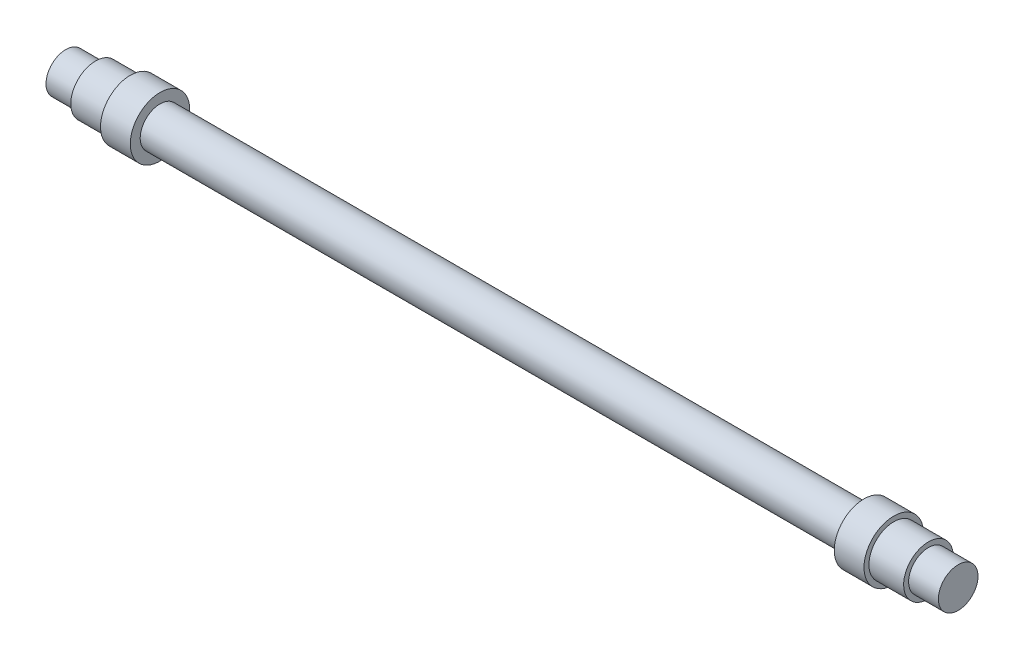
ISO-10303-21;
HEADER;
FILE_DESCRIPTION(('STEP AP214'),'2;1');
FILE_NAME('part.step','',(''),(''),'','','');
FILE_SCHEMA(('AUTOMOTIVE_DESIGN { 1 0 10303 214 1 1 1 1 }'));
ENDSEC;
DATA;
#1=APPLICATION_CONTEXT('core data for automotive mechanical design processes');
#2=APPLICATION_PROTOCOL_DEFINITION('international standard','automotive_design',2000,#1);
#3=PRODUCT_CONTEXT('',#1,'mechanical');
#4=PRODUCT('Part','Part','',(#3));
#5=PRODUCT_RELATED_PRODUCT_CATEGORY('part','',(#4));
#6=PRODUCT_DEFINITION_FORMATION('','',#4);
#7=PRODUCT_DEFINITION_CONTEXT('part definition',#1,'design');
#8=PRODUCT_DEFINITION('design','',#6,#7);
#9=PRODUCT_DEFINITION_SHAPE('','',#8);
#10=(LENGTH_UNIT() NAMED_UNIT(*) SI_UNIT(.MILLI.,.METRE.));
#11=(NAMED_UNIT(*) PLANE_ANGLE_UNIT() SI_UNIT($,.RADIAN.));
#12=(NAMED_UNIT(*) SI_UNIT($,.STERADIAN.) SOLID_ANGLE_UNIT());
#13=UNCERTAINTY_MEASURE_WITH_UNIT(LENGTH_MEASURE(1.E-05),#10,'distance_accuracy_value','');
#14=(GEOMETRIC_REPRESENTATION_CONTEXT(3) GLOBAL_UNCERTAINTY_ASSIGNED_CONTEXT((#13)) GLOBAL_UNIT_ASSIGNED_CONTEXT((#10,
#11,#12)) REPRESENTATION_CONTEXT('',''));
#15=CARTESIAN_POINT('',(0.,0.,0.));
#16=DIRECTION('',(0.,0.,1.));
#17=DIRECTION('',(1.,0.,0.));
#18=AXIS2_PLACEMENT_3D('',#15,#16,#17);
#19=CARTESIAN_POINT('',(0.,0.,0.));
#20=DIRECTION('',(-1.,0.,0.));
#21=DIRECTION('',(0.,-1.,0.));
#22=AXIS2_PLACEMENT_3D('',#19,#20,#21);
#23=PLANE('',#22);
#24=CARTESIAN_POINT('',(0.,0.,0.));
#25=DIRECTION('',(1.,0.,0.));
#26=DIRECTION('',(0.,1.,0.));
#27=AXIS2_PLACEMENT_3D('',#24,#25,#26);
#28=CIRCLE('',#27,1.99999999999999);
#29=CARTESIAN_POINT('',(0.,1.99999999999999,0.));
#30=VERTEX_POINT('',#29);
#31=EDGE_CURVE('E10',#30,#30,#28,.T.);
#32=ORIENTED_EDGE('',*,*,#31,.F.);
#33=EDGE_LOOP('',(#32));
#34=FACE_BOUND('',#33,.T.);
#35=ADVANCED_FACE('F31',(#34),#23,.T.);
#36=CARTESIAN_POINT('',(90.,0.,0.));
#37=DIRECTION('',(1.,0.,0.));
#38=DIRECTION('',(0.,1.,0.));
#39=AXIS2_PLACEMENT_3D('',#36,#37,#38);
#40=CYLINDRICAL_SURFACE('',#39,1.99999999999999);
#41=ORIENTED_EDGE('',*,*,#31,.T.);
#42=EDGE_LOOP('',(#41));
#43=FACE_BOUND('',#42,.T.);
#44=CARTESIAN_POINT('',(3.,0.,0.));
#45=DIRECTION('',(1.,0.,0.));
#46=DIRECTION('',(0.,1.,0.));
#47=AXIS2_PLACEMENT_3D('',#44,#45,#46);
#48=CIRCLE('',#47,1.99999999999999);
#49=CARTESIAN_POINT('',(3.,1.99999999999999,0.));
#50=VERTEX_POINT('',#49);
#51=EDGE_CURVE('E37',#50,#50,#48,.T.);
#52=ORIENTED_EDGE('',*,*,#51,.F.);
#53=EDGE_LOOP('',(#52));
#54=FACE_BOUND('',#53,.T.);
#55=ADVANCED_FACE('F97',(#43,#54),#40,.T.);
#56=CARTESIAN_POINT('',(3.,1.99999999999999,0.));
#57=DIRECTION('',(-1.,0.,0.));
#58=DIRECTION('',(0.,-1.,0.));
#59=AXIS2_PLACEMENT_3D('',#56,#57,#58);
#60=PLANE('',#59);
#61=ORIENTED_EDGE('',*,*,#51,.T.);
#62=EDGE_LOOP('',(#61));
#63=FACE_BOUND('',#62,.T.);
#64=CARTESIAN_POINT('',(3.,0.,0.));
#65=DIRECTION('',(1.,0.,0.));
#66=DIRECTION('',(0.,1.,0.));
#67=AXIS2_PLACEMENT_3D('',#64,#65,#66);
#68=CIRCLE('',#67,2.49999999999999);
#69=CARTESIAN_POINT('',(3.,2.49999999999999,0.));
#70=VERTEX_POINT('',#69);
#71=EDGE_CURVE('E41',#70,#70,#68,.T.);
#72=ORIENTED_EDGE('',*,*,#71,.F.);
#73=EDGE_LOOP('',(#72));
#74=FACE_BOUND('',#73,.T.);
#75=ADVANCED_FACE('F102',(#63,#74),#60,.T.);
#76=CARTESIAN_POINT('',(90.,0.,0.));
#77=DIRECTION('',(1.,0.,0.));
#78=DIRECTION('',(0.,1.,0.));
#79=AXIS2_PLACEMENT_3D('',#76,#77,#78);
#80=CYLINDRICAL_SURFACE('',#79,2.49999999999999);
#81=ORIENTED_EDGE('',*,*,#71,.T.);
#82=EDGE_LOOP('',(#81));
#83=FACE_BOUND('',#82,.T.);
#84=CARTESIAN_POINT('',(6.50000000000001,0.,0.));
#85=DIRECTION('',(1.,0.,0.));
#86=DIRECTION('',(0.,1.,0.));
#87=AXIS2_PLACEMENT_3D('',#84,#85,#86);
#88=CIRCLE('',#87,2.49999999999999);
#89=CARTESIAN_POINT('',(6.50000000000001,2.49999999999999,0.));
#90=VERTEX_POINT('',#89);
#91=EDGE_CURVE('E45',#90,#90,#88,.T.);
#92=ORIENTED_EDGE('',*,*,#91,.F.);
#93=EDGE_LOOP('',(#92));
#94=FACE_BOUND('',#93,.T.);
#95=ADVANCED_FACE('F106',(#83,#94),#80,.T.);
#96=CARTESIAN_POINT('',(6.5,2.49999999999999,0.));
#97=DIRECTION('',(-1.,0.,0.));
#98=DIRECTION('',(0.,-1.,0.));
#99=AXIS2_PLACEMENT_3D('',#96,#97,#98);
#100=PLANE('',#99);
#101=ORIENTED_EDGE('',*,*,#91,.T.);
#102=EDGE_LOOP('',(#101));
#103=FACE_BOUND('',#102,.T.);
#104=CARTESIAN_POINT('',(6.50000000000001,0.,0.));
#105=DIRECTION('',(1.,0.,0.));
#106=DIRECTION('',(0.,1.,0.));
#107=AXIS2_PLACEMENT_3D('',#104,#105,#106);
#108=CIRCLE('',#107,2.99999999999998);
#109=CARTESIAN_POINT('',(6.50000000000001,2.99999999999998,0.));
#110=VERTEX_POINT('',#109);
#111=EDGE_CURVE('E50',#110,#110,#108,.T.);
#112=ORIENTED_EDGE('',*,*,#111,.F.);
#113=EDGE_LOOP('',(#112));
#114=FACE_BOUND('',#113,.T.);
#115=ADVANCED_FACE('F112',(#103,#114),#100,.T.);
#116=CARTESIAN_POINT('',(90.,0.,0.));
#117=DIRECTION('',(1.,0.,0.));
#118=DIRECTION('',(0.,1.,0.));
#119=AXIS2_PLACEMENT_3D('',#116,#117,#118);
#120=CYLINDRICAL_SURFACE('',#119,2.99999999999998);
#121=ORIENTED_EDGE('',*,*,#111,.T.);
#122=EDGE_LOOP('',(#121));
#123=FACE_BOUND('',#122,.T.);
#124=CARTESIAN_POINT('',(9.50000000000001,0.,0.));
#125=DIRECTION('',(1.,0.,0.));
#126=DIRECTION('',(0.,1.,0.));
#127=AXIS2_PLACEMENT_3D('',#124,#125,#126);
#128=CIRCLE('',#127,2.99999999999998);
#129=CARTESIAN_POINT('',(9.50000000000001,2.99999999999998,0.));
#130=VERTEX_POINT('',#129);
#131=EDGE_CURVE('E53',#130,#130,#128,.T.);
#132=ORIENTED_EDGE('',*,*,#131,.F.);
#133=EDGE_LOOP('',(#132));
#134=FACE_BOUND('',#133,.T.);
#135=ADVANCED_FACE('F116',(#123,#134),#120,.T.);
#136=CARTESIAN_POINT('',(9.5,2.99999999999998,0.));
#137=DIRECTION('',(1.,0.,0.));
#138=DIRECTION('',(0.,1.,0.));
#139=AXIS2_PLACEMENT_3D('',#136,#137,#138);
#140=PLANE('',#139);
#141=ORIENTED_EDGE('',*,*,#131,.T.);
#142=EDGE_LOOP('',(#141));
#143=FACE_BOUND('',#142,.T.);
#144=CARTESIAN_POINT('',(9.50000000000001,0.,0.));
#145=DIRECTION('',(1.,0.,0.));
#146=DIRECTION('',(0.,1.,0.));
#147=AXIS2_PLACEMENT_3D('',#144,#145,#146);
#148=CIRCLE('',#147,1.99999999999999);
#149=CARTESIAN_POINT('',(9.50000000000001,1.99999999999999,0.));
#150=VERTEX_POINT('',#149);
#151=EDGE_CURVE('E56',#150,#150,#148,.T.);
#152=ORIENTED_EDGE('',*,*,#151,.F.);
#153=EDGE_LOOP('',(#152));
#154=FACE_BOUND('',#153,.T.);
#155=ADVANCED_FACE('F120',(#143,#154),#140,.T.);
#156=CARTESIAN_POINT('',(90.,0.,0.));
#157=DIRECTION('',(1.,0.,0.));
#158=DIRECTION('',(0.,1.,0.));
#159=AXIS2_PLACEMENT_3D('',#156,#157,#158);
#160=CYLINDRICAL_SURFACE('',#159,1.99999999999999);
#161=ORIENTED_EDGE('',*,*,#151,.T.);
#162=EDGE_LOOP('',(#161));
#163=FACE_BOUND('',#162,.T.);
#164=CARTESIAN_POINT('',(80.5,0.,0.));
#165=DIRECTION('',(1.,0.,0.));
#166=DIRECTION('',(0.,1.,0.));
#167=AXIS2_PLACEMENT_3D('',#164,#165,#166);
#168=CIRCLE('',#167,1.99999999999998);
#169=CARTESIAN_POINT('',(80.5,1.99999999999999,0.));
#170=VERTEX_POINT('',#169);
#171=EDGE_CURVE('E59',#170,#170,#168,.T.);
#172=ORIENTED_EDGE('',*,*,#171,.F.);
#173=EDGE_LOOP('',(#172));
#174=FACE_BOUND('',#173,.T.);
#175=ADVANCED_FACE('F124',(#163,#174),#160,.T.);
#176=CARTESIAN_POINT('',(80.5,1.99999999999999,0.));
#177=DIRECTION('',(-1.,0.,0.));
#178=DIRECTION('',(0.,-1.,0.));
#179=AXIS2_PLACEMENT_3D('',#176,#177,#178);
#180=PLANE('',#179);
#181=ORIENTED_EDGE('',*,*,#171,.T.);
#182=EDGE_LOOP('',(#181));
#183=FACE_BOUND('',#182,.T.);
#184=CARTESIAN_POINT('',(80.5,0.,0.));
#185=DIRECTION('',(1.,0.,0.));
#186=DIRECTION('',(0.,1.,0.));
#187=AXIS2_PLACEMENT_3D('',#184,#185,#186);
#188=CIRCLE('',#187,2.99999999999998);
#189=CARTESIAN_POINT('',(80.5,2.99999999999999,0.));
#190=VERTEX_POINT('',#189);
#191=EDGE_CURVE('E62',#190,#190,#188,.T.);
#192=ORIENTED_EDGE('',*,*,#191,.F.);
#193=EDGE_LOOP('',(#192));
#194=FACE_BOUND('',#193,.T.);
#195=ADVANCED_FACE('F128',(#183,#194),#180,.T.);
#196=CARTESIAN_POINT('',(90.,0.,0.));
#197=DIRECTION('',(1.,0.,0.));
#198=DIRECTION('',(0.,1.,0.));
#199=AXIS2_PLACEMENT_3D('',#196,#197,#198);
#200=CYLINDRICAL_SURFACE('',#199,2.99999999999998);
#201=ORIENTED_EDGE('',*,*,#191,.T.);
#202=EDGE_LOOP('',(#201));
#203=FACE_BOUND('',#202,.T.);
#204=CARTESIAN_POINT('',(83.5,0.,0.));
#205=DIRECTION('',(1.,0.,0.));
#206=DIRECTION('',(0.,1.,0.));
#207=AXIS2_PLACEMENT_3D('',#204,#205,#206);
#208=CIRCLE('',#207,2.99999999999998);
#209=CARTESIAN_POINT('',(83.5,2.99999999999999,0.));
#210=VERTEX_POINT('',#209);
#211=EDGE_CURVE('E65',#210,#210,#208,.T.);
#212=ORIENTED_EDGE('',*,*,#211,.F.);
#213=EDGE_LOOP('',(#212));
#214=FACE_BOUND('',#213,.T.);
#215=ADVANCED_FACE('F132',(#203,#214),#200,.T.);
#216=CARTESIAN_POINT('',(83.5,2.99999999999999,0.));
#217=DIRECTION('',(1.,0.,0.));
#218=DIRECTION('',(0.,1.,0.));
#219=AXIS2_PLACEMENT_3D('',#216,#217,#218);
#220=PLANE('',#219);
#221=ORIENTED_EDGE('',*,*,#211,.T.);
#222=EDGE_LOOP('',(#221));
#223=FACE_BOUND('',#222,.T.);
#224=CARTESIAN_POINT('',(83.5,0.,0.));
#225=DIRECTION('',(1.,0.,0.));
#226=DIRECTION('',(0.,1.,0.));
#227=AXIS2_PLACEMENT_3D('',#224,#225,#226);
#228=CIRCLE('',#227,2.49999999999998);
#229=CARTESIAN_POINT('',(83.5,2.49999999999999,0.));
#230=VERTEX_POINT('',#229);
#231=EDGE_CURVE('E68',#230,#230,#228,.T.);
#232=ORIENTED_EDGE('',*,*,#231,.F.);
#233=EDGE_LOOP('',(#232));
#234=FACE_BOUND('',#233,.T.);
#235=ADVANCED_FACE('F136',(#223,#234),#220,.T.);
#236=CARTESIAN_POINT('',(90.,0.,0.));
#237=DIRECTION('',(1.,0.,0.));
#238=DIRECTION('',(0.,1.,0.));
#239=AXIS2_PLACEMENT_3D('',#236,#237,#238);
#240=CYLINDRICAL_SURFACE('',#239,2.49999999999998);
#241=ORIENTED_EDGE('',*,*,#231,.T.);
#242=EDGE_LOOP('',(#241));
#243=FACE_BOUND('',#242,.T.);
#244=CARTESIAN_POINT('',(87.,0.,0.));
#245=DIRECTION('',(1.,0.,0.));
#246=DIRECTION('',(0.,1.,0.));
#247=AXIS2_PLACEMENT_3D('',#244,#245,#246);
#248=CIRCLE('',#247,2.49999999999998);
#249=CARTESIAN_POINT('',(87.,2.49999999999999,0.));
#250=VERTEX_POINT('',#249);
#251=EDGE_CURVE('E71',#250,#250,#248,.T.);
#252=ORIENTED_EDGE('',*,*,#251,.F.);
#253=EDGE_LOOP('',(#252));
#254=FACE_BOUND('',#253,.T.);
#255=ADVANCED_FACE('F93',(#243,#254),#240,.T.);
#256=CARTESIAN_POINT('',(87.,2.49999999999999,0.));
#257=DIRECTION('',(1.,0.,0.));
#258=DIRECTION('',(0.,1.,0.));
#259=AXIS2_PLACEMENT_3D('',#256,#257,#258);
#260=PLANE('',#259);
#261=ORIENTED_EDGE('',*,*,#251,.T.);
#262=EDGE_LOOP('',(#261));
#263=FACE_BOUND('',#262,.T.);
#264=CARTESIAN_POINT('',(87.,0.,0.));
#265=DIRECTION('',(1.,0.,0.));
#266=DIRECTION('',(0.,1.,0.));
#267=AXIS2_PLACEMENT_3D('',#264,#265,#266);
#268=CIRCLE('',#267,1.99999999999998);
#269=CARTESIAN_POINT('',(87.,1.99999999999999,0.));
#270=VERTEX_POINT('',#269);
#271=EDGE_CURVE('E74',#270,#270,#268,.T.);
#272=ORIENTED_EDGE('',*,*,#271,.F.);
#273=EDGE_LOOP('',(#272));
#274=FACE_BOUND('',#273,.T.);
#275=ADVANCED_FACE('F85',(#263,#274),#260,.T.);
#276=CARTESIAN_POINT('',(90.,0.,0.));
#277=DIRECTION('',(1.,0.,0.));
#278=DIRECTION('',(0.,1.,0.));
#279=AXIS2_PLACEMENT_3D('',#276,#277,#278);
#280=CYLINDRICAL_SURFACE('',#279,1.99999999999999);
#281=ORIENTED_EDGE('',*,*,#271,.T.);
#282=EDGE_LOOP('',(#281));
#283=FACE_BOUND('',#282,.T.);
#284=CARTESIAN_POINT('',(90.,0.,0.));
#285=DIRECTION('',(1.,0.,0.));
#286=DIRECTION('',(0.,1.,0.));
#287=AXIS2_PLACEMENT_3D('',#284,#285,#286);
#288=CIRCLE('',#287,1.99999999999999);
#289=CARTESIAN_POINT('',(90.,2.,0.));
#290=VERTEX_POINT('',#289);
#291=EDGE_CURVE('E77',#290,#290,#288,.T.);
#292=ORIENTED_EDGE('',*,*,#291,.F.);
#293=EDGE_LOOP('',(#292));
#294=FACE_BOUND('',#293,.T.);
#295=ADVANCED_FACE('F83',(#283,#294),#280,.T.);
#296=CARTESIAN_POINT('',(90.,2.,0.));
#297=DIRECTION('',(1.,0.,0.));
#298=DIRECTION('',(0.,1.,0.));
#299=AXIS2_PLACEMENT_3D('',#296,#297,#298);
#300=PLANE('',#299);
#301=ORIENTED_EDGE('',*,*,#291,.T.);
#302=EDGE_LOOP('',(#301));
#303=FACE_BOUND('',#302,.T.);
#304=ADVANCED_FACE('F81',(#303),#300,.T.);
#305=CLOSED_SHELL('',(#35,#55,#75,#95,#115,#135,#155,#175,#195,#215,#235,#255,#275,#295,#304));
#306=MANIFOLD_SOLID_BREP('B2',#305);
#307=ADVANCED_BREP_SHAPE_REPRESENTATION('',(#18,#306),#14);
#308=SHAPE_DEFINITION_REPRESENTATION(#9,#307);
ENDSEC;
END-ISO-10303-21;
